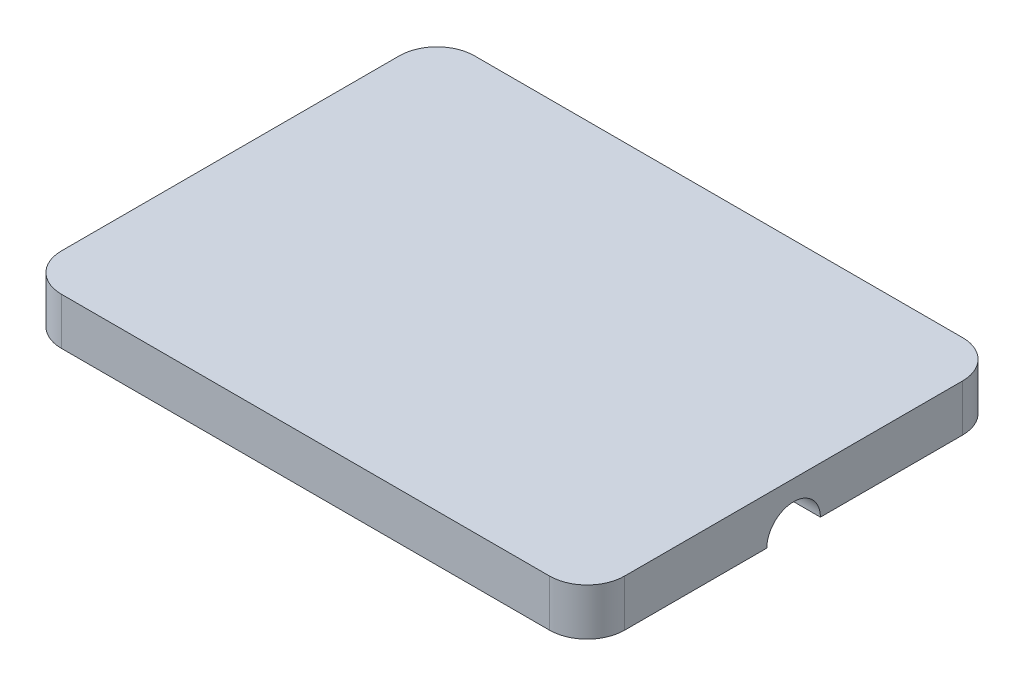
ISO-10303-21;
HEADER;
FILE_DESCRIPTION(('STEP AP214'),'2;1');
FILE_NAME('part.step','',(''),(''),'','','');
FILE_SCHEMA(('AUTOMOTIVE_DESIGN { 1 0 10303 214 1 1 1 1 }'));
ENDSEC;
DATA;
#1=APPLICATION_CONTEXT('core data for automotive mechanical design processes');
#2=APPLICATION_PROTOCOL_DEFINITION('international standard','automotive_design',2000,#1);
#3=PRODUCT_CONTEXT('',#1,'mechanical');
#4=PRODUCT('Part','Part','',(#3));
#5=PRODUCT_RELATED_PRODUCT_CATEGORY('part','',(#4));
#6=PRODUCT_DEFINITION_FORMATION('','',#4);
#7=PRODUCT_DEFINITION_CONTEXT('part definition',#1,'design');
#8=PRODUCT_DEFINITION('design','',#6,#7);
#9=PRODUCT_DEFINITION_SHAPE('','',#8);
#10=(LENGTH_UNIT() NAMED_UNIT(*) SI_UNIT(.MILLI.,.METRE.));
#11=(NAMED_UNIT(*) PLANE_ANGLE_UNIT() SI_UNIT($,.RADIAN.));
#12=(NAMED_UNIT(*) SI_UNIT($,.STERADIAN.) SOLID_ANGLE_UNIT());
#13=UNCERTAINTY_MEASURE_WITH_UNIT(LENGTH_MEASURE(1.E-05),#10,'distance_accuracy_value','');
#14=(GEOMETRIC_REPRESENTATION_CONTEXT(3) GLOBAL_UNCERTAINTY_ASSIGNED_CONTEXT((#13)) GLOBAL_UNIT_ASSIGNED_CONTEXT((#10,
#11,#12)) REPRESENTATION_CONTEXT('',''));
#15=CARTESIAN_POINT('',(0.,0.,0.));
#16=DIRECTION('',(0.,0.,1.));
#17=DIRECTION('',(1.,0.,0.));
#18=AXIS2_PLACEMENT_3D('',#15,#16,#17);
#19=CARTESIAN_POINT('',(20.,0.,-90.));
#20=DIRECTION('',(0.,1.,0.));
#21=DIRECTION('',(0.,0.,1.));
#22=AXIS2_PLACEMENT_3D('',#19,#20,#21);
#23=PLANE('',#22);
#24=DIRECTION('',(-1.,0.,0.));
#25=VECTOR('',#24,1.);
#26=CARTESIAN_POINT('',(300.,0.,-14.285));
#27=LINE('',#26,#25);
#28=CARTESIAN_POINT('',(0.,0.,-14.285));
#29=VERTEX_POINT('',#28);
#30=CARTESIAN_POINT('',(300.,0.,-14.285));
#31=VERTEX_POINT('',#30);
#32=EDGE_CURVE('E11',#29,#31,#27,.F.);
#33=ORIENTED_EDGE('',*,*,#32,.F.);
#34=DIRECTION('',(0.,0.,1.));
#35=VECTOR('',#34,1.);
#36=CARTESIAN_POINT('',(0.,0.,0.));
#37=LINE('',#36,#35);
#38=CARTESIAN_POINT('',(0.,0.,-89.9999999999999));
#39=VERTEX_POINT('',#38);
#40=EDGE_CURVE('E180',#39,#29,#37,.T.);
#41=ORIENTED_EDGE('',*,*,#40,.F.);
#42=CARTESIAN_POINT('',(20.,0.,-90.));
#43=DIRECTION('',(0.,1.,0.));
#44=DIRECTION('',(0.,0.,1.));
#45=AXIS2_PLACEMENT_3D('',#42,#43,#44);
#46=CIRCLE('',#45,20.);
#47=CARTESIAN_POINT('',(20.0000000000001,0.,-110.));
#48=VERTEX_POINT('',#47);
#49=EDGE_CURVE('E99',#48,#39,#46,.T.);
#50=ORIENTED_EDGE('',*,*,#49,.F.);
#51=DIRECTION('',(-1.,0.,0.));
#52=VECTOR('',#51,1.);
#53=CARTESIAN_POINT('',(20.0000000000001,0.,-110.));
#54=LINE('',#53,#52);
#55=CARTESIAN_POINT('',(280.,0.,-110.));
#56=VERTEX_POINT('',#55);
#57=EDGE_CURVE('E174',#56,#48,#54,.T.);
#58=ORIENTED_EDGE('',*,*,#57,.F.);
#59=CARTESIAN_POINT('',(280.,0.,-90.));
#60=DIRECTION('',(0.,1.,0.));
#61=DIRECTION('',(0.,0.,-1.));
#62=AXIS2_PLACEMENT_3D('',#59,#60,#61);
#63=CIRCLE('',#62,20.);
#64=CARTESIAN_POINT('',(300.,0.,-89.9999999999999));
#65=VERTEX_POINT('',#64);
#66=EDGE_CURVE('E140',#65,#56,#63,.T.);
#67=ORIENTED_EDGE('',*,*,#66,.F.);
#68=DIRECTION('',(0.,0.,-1.));
#69=VECTOR('',#68,1.);
#70=CARTESIAN_POINT('',(300.,0.,-89.9999999999999));
#71=LINE('',#70,#69);
#72=EDGE_CURVE('E167',#31,#65,#71,.T.);
#73=ORIENTED_EDGE('',*,*,#72,.F.);
#74=EDGE_LOOP('',(#33,#41,#50,#58,#67,#73));
#75=FACE_BOUND('',#74,.T.);
#76=ADVANCED_FACE('F40',(#75),#23,.F.);
#77=DIRECTION('',(-1.,0.,0.));
#78=VECTOR('',#77,1.);
#79=CARTESIAN_POINT('',(300.,0.,14.285));
#80=LINE('',#79,#78);
#81=CARTESIAN_POINT('',(300.,0.,14.285));
#82=VERTEX_POINT('',#81);
#83=CARTESIAN_POINT('',(0.,0.,14.285));
#84=VERTEX_POINT('',#83);
#85=EDGE_CURVE('E49',#82,#84,#80,.T.);
#86=ORIENTED_EDGE('',*,*,#85,.F.);
#87=CARTESIAN_POINT('',(300.,0.,89.9999999999999));
#88=VERTEX_POINT('',#87);
#89=EDGE_CURVE('E168',#88,#82,#71,.T.);
#90=ORIENTED_EDGE('',*,*,#89,.F.);
#91=CARTESIAN_POINT('',(280.,0.,90.));
#92=DIRECTION('',(0.,1.,0.));
#93=DIRECTION('',(0.,0.,1.));
#94=AXIS2_PLACEMENT_3D('',#91,#92,#93);
#95=CIRCLE('',#94,20.);
#96=CARTESIAN_POINT('',(280.,0.,110.));
#97=VERTEX_POINT('',#96);
#98=EDGE_CURVE('E163',#97,#88,#95,.T.);
#99=ORIENTED_EDGE('',*,*,#98,.F.);
#100=DIRECTION('',(1.,0.,0.));
#101=VECTOR('',#100,1.);
#102=CARTESIAN_POINT('',(280.,0.,110.));
#103=LINE('',#102,#101);
#104=CARTESIAN_POINT('',(20.0000000000001,0.,110.));
#105=VERTEX_POINT('',#104);
#106=EDGE_CURVE('E160',#105,#97,#103,.T.);
#107=ORIENTED_EDGE('',*,*,#106,.F.);
#108=CARTESIAN_POINT('',(20.,0.,90.));
#109=DIRECTION('',(0.,1.,0.));
#110=DIRECTION('',(0.,0.,-1.));
#111=AXIS2_PLACEMENT_3D('',#108,#109,#110);
#112=CIRCLE('',#111,20.);
#113=CARTESIAN_POINT('',(0.,0.,89.9999999999999));
#114=VERTEX_POINT('',#113);
#115=EDGE_CURVE('E157',#114,#105,#112,.T.);
#116=ORIENTED_EDGE('',*,*,#115,.F.);
#117=EDGE_CURVE('E179',#84,#114,#37,.T.);
#118=ORIENTED_EDGE('',*,*,#117,.F.);
#119=EDGE_LOOP('',(#86,#90,#99,#107,#116,#118));
#120=FACE_BOUND('',#119,.T.);
#121=ADVANCED_FACE('F219',(#120),#23,.F.);
#122=CARTESIAN_POINT('',(20.,25.,90.));
#123=DIRECTION('',(0.,-1.,0.));
#124=DIRECTION('',(0.,0.,-1.));
#125=AXIS2_PLACEMENT_3D('',#122,#123,#124);
#126=CYLINDRICAL_SURFACE('',#125,20.);
#127=ORIENTED_EDGE('',*,*,#115,.T.);
#128=DIRECTION('',(0.,-1.,0.));
#129=VECTOR('',#128,1.);
#130=CARTESIAN_POINT('',(20.0000000000001,25.,110.));
#131=LINE('',#130,#129);
#132=CARTESIAN_POINT('',(20.0000000000001,25.,110.));
#133=VERTEX_POINT('',#132);
#134=EDGE_CURVE('E198',#133,#105,#131,.T.);
#135=ORIENTED_EDGE('',*,*,#134,.F.);
#136=CARTESIAN_POINT('',(20.,25.,90.));
#137=DIRECTION('',(0.,1.,0.));
#138=DIRECTION('',(0.,0.,-1.));
#139=AXIS2_PLACEMENT_3D('',#136,#137,#138);
#140=CIRCLE('',#139,20.);
#141=CARTESIAN_POINT('',(0.,25.,89.9999999999999));
#142=VERTEX_POINT('',#141);
#143=EDGE_CURVE('E107',#142,#133,#140,.T.);
#144=ORIENTED_EDGE('',*,*,#143,.F.);
#145=DIRECTION('',(0.,-1.,0.));
#146=VECTOR('',#145,1.);
#147=CARTESIAN_POINT('',(0.,25.,89.9999999999999));
#148=LINE('',#147,#146);
#149=EDGE_CURVE('E202',#142,#114,#148,.T.);
#150=ORIENTED_EDGE('',*,*,#149,.T.);
#151=EDGE_LOOP('',(#127,#135,#144,#150));
#152=FACE_BOUND('',#151,.T.);
#153=ADVANCED_FACE('F42',(#152),#126,.T.);
#154=CARTESIAN_POINT('',(280.,25.,110.));
#155=DIRECTION('',(0.,0.,-1.));
#156=DIRECTION('',(-1.,0.,0.));
#157=AXIS2_PLACEMENT_3D('',#154,#155,#156);
#158=PLANE('',#157);
#159=ORIENTED_EDGE('',*,*,#106,.T.);
#160=DIRECTION('',(0.,-1.,0.));
#161=VECTOR('',#160,1.);
#162=CARTESIAN_POINT('',(280.,25.,110.));
#163=LINE('',#162,#161);
#164=CARTESIAN_POINT('',(280.,25.,110.));
#165=VERTEX_POINT('',#164);
#166=EDGE_CURVE('E194',#165,#97,#163,.T.);
#167=ORIENTED_EDGE('',*,*,#166,.F.);
#168=DIRECTION('',(1.,0.,0.));
#169=VECTOR('',#168,1.);
#170=CARTESIAN_POINT('',(280.,25.,110.));
#171=LINE('',#170,#169);
#172=EDGE_CURVE('E230',#133,#165,#171,.T.);
#173=ORIENTED_EDGE('',*,*,#172,.F.);
#174=ORIENTED_EDGE('',*,*,#134,.T.);
#175=EDGE_LOOP('',(#159,#167,#173,#174));
#176=FACE_BOUND('',#175,.T.);
#177=ADVANCED_FACE('F249',(#176),#158,.F.);
#178=CARTESIAN_POINT('',(280.,25.,90.));
#179=DIRECTION('',(0.,-1.,0.));
#180=DIRECTION('',(0.,0.,-1.));
#181=AXIS2_PLACEMENT_3D('',#178,#179,#180);
#182=CYLINDRICAL_SURFACE('',#181,20.);
#183=ORIENTED_EDGE('',*,*,#98,.T.);
#184=DIRECTION('',(0.,-1.,0.));
#185=VECTOR('',#184,1.);
#186=CARTESIAN_POINT('',(300.,25.,89.9999999999999));
#187=LINE('',#186,#185);
#188=CARTESIAN_POINT('',(300.,25.,89.9999999999999));
#189=VERTEX_POINT('',#188);
#190=EDGE_CURVE('E190',#189,#88,#187,.T.);
#191=ORIENTED_EDGE('',*,*,#190,.F.);
#192=CARTESIAN_POINT('',(280.,25.,90.));
#193=DIRECTION('',(0.,1.,0.));
#194=DIRECTION('',(0.,0.,1.));
#195=AXIS2_PLACEMENT_3D('',#192,#193,#194);
#196=CIRCLE('',#195,20.);
#197=EDGE_CURVE('E233',#165,#189,#196,.T.);
#198=ORIENTED_EDGE('',*,*,#197,.F.);
#199=ORIENTED_EDGE('',*,*,#166,.T.);
#200=EDGE_LOOP('',(#183,#191,#198,#199));
#201=FACE_BOUND('',#200,.T.);
#202=ADVANCED_FACE('F241',(#201),#182,.T.);
#203=CARTESIAN_POINT('',(300.,25.,-89.9999999999999));
#204=DIRECTION('',(-1.,0.,0.));
#205=DIRECTION('',(0.,0.,1.));
#206=AXIS2_PLACEMENT_3D('',#203,#204,#205);
#207=PLANE('',#206);
#208=CARTESIAN_POINT('',(300.,0.,0.));
#209=DIRECTION('',(1.,0.,0.));
#210=DIRECTION('',(0.,0.,-1.));
#211=AXIS2_PLACEMENT_3D('',#208,#209,#210);
#212=CIRCLE('',#211,14.285);
#213=EDGE_CURVE('E55',#31,#82,#212,.T.);
#214=ORIENTED_EDGE('',*,*,#213,.F.);
#215=ORIENTED_EDGE('',*,*,#72,.T.);
#216=DIRECTION('',(0.,-1.,0.));
#217=VECTOR('',#216,1.);
#218=CARTESIAN_POINT('',(300.,25.,-89.9999999999999));
#219=LINE('',#218,#217);
#220=CARTESIAN_POINT('',(300.,25.,-89.9999999999999));
#221=VERTEX_POINT('',#220);
#222=EDGE_CURVE('E144',#221,#65,#219,.T.);
#223=ORIENTED_EDGE('',*,*,#222,.F.);
#224=DIRECTION('',(0.,0.,-1.));
#225=VECTOR('',#224,1.);
#226=CARTESIAN_POINT('',(300.,25.,0.));
#227=LINE('',#226,#225);
#228=EDGE_CURVE('E130',#189,#221,#227,.T.);
#229=ORIENTED_EDGE('',*,*,#228,.F.);
#230=ORIENTED_EDGE('',*,*,#190,.T.);
#231=ORIENTED_EDGE('',*,*,#89,.T.);
#232=EDGE_LOOP('',(#214,#215,#223,#229,#230,#231));
#233=FACE_BOUND('',#232,.T.);
#234=ADVANCED_FACE('F244',(#233),#207,.F.);
#235=CARTESIAN_POINT('',(280.,25.,-90.));
#236=DIRECTION('',(0.,-1.,0.));
#237=DIRECTION('',(0.,0.,-1.));
#238=AXIS2_PLACEMENT_3D('',#235,#236,#237);
#239=CYLINDRICAL_SURFACE('',#238,20.);
#240=ORIENTED_EDGE('',*,*,#66,.T.);
#241=DIRECTION('',(0.,-1.,0.));
#242=VECTOR('',#241,1.);
#243=CARTESIAN_POINT('',(280.,25.,-110.));
#244=LINE('',#243,#242);
#245=CARTESIAN_POINT('',(280.,25.,-110.));
#246=VERTEX_POINT('',#245);
#247=EDGE_CURVE('E137',#246,#56,#244,.T.);
#248=ORIENTED_EDGE('',*,*,#247,.F.);
#249=CARTESIAN_POINT('',(280.,25.,-90.));
#250=DIRECTION('',(0.,1.,0.));
#251=DIRECTION('',(0.,0.,-1.));
#252=AXIS2_PLACEMENT_3D('',#249,#250,#251);
#253=CIRCLE('',#252,20.);
#254=EDGE_CURVE('E123',#221,#246,#253,.T.);
#255=ORIENTED_EDGE('',*,*,#254,.F.);
#256=ORIENTED_EDGE('',*,*,#222,.T.);
#257=EDGE_LOOP('',(#240,#248,#255,#256));
#258=FACE_BOUND('',#257,.T.);
#259=ADVANCED_FACE('F138',(#258),#239,.T.);
#260=CARTESIAN_POINT('',(20.0000000000001,25.,-110.));
#261=DIRECTION('',(0.,0.,1.));
#262=DIRECTION('',(1.,0.,0.));
#263=AXIS2_PLACEMENT_3D('',#260,#261,#262);
#264=PLANE('',#263);
#265=ORIENTED_EDGE('',*,*,#57,.T.);
#266=DIRECTION('',(0.,-1.,0.));
#267=VECTOR('',#266,1.);
#268=CARTESIAN_POINT('',(20.0000000000001,25.,-110.));
#269=LINE('',#268,#267);
#270=CARTESIAN_POINT('',(20.0000000000001,25.,-110.));
#271=VERTEX_POINT('',#270);
#272=EDGE_CURVE('E145',#271,#48,#269,.T.);
#273=ORIENTED_EDGE('',*,*,#272,.F.);
#274=DIRECTION('',(-1.,0.,0.));
#275=VECTOR('',#274,1.);
#276=CARTESIAN_POINT('',(20.0000000000001,25.,-110.));
#277=LINE('',#276,#275);
#278=EDGE_CURVE('E127',#246,#271,#277,.T.);
#279=ORIENTED_EDGE('',*,*,#278,.F.);
#280=ORIENTED_EDGE('',*,*,#247,.T.);
#281=EDGE_LOOP('',(#265,#273,#279,#280));
#282=FACE_BOUND('',#281,.T.);
#283=ADVANCED_FACE('F147',(#282),#264,.F.);
#284=CARTESIAN_POINT('',(20.,25.,-90.));
#285=DIRECTION('',(0.,-1.,0.));
#286=DIRECTION('',(0.,0.,-1.));
#287=AXIS2_PLACEMENT_3D('',#284,#285,#286);
#288=CYLINDRICAL_SURFACE('',#287,20.);
#289=ORIENTED_EDGE('',*,*,#49,.T.);
#290=DIRECTION('',(0.,-1.,0.));
#291=VECTOR('',#290,1.);
#292=CARTESIAN_POINT('',(0.,25.,-89.9999999999999));
#293=LINE('',#292,#291);
#294=CARTESIAN_POINT('',(0.,25.,-89.9999999999999));
#295=VERTEX_POINT('',#294);
#296=EDGE_CURVE('E153',#295,#39,#293,.T.);
#297=ORIENTED_EDGE('',*,*,#296,.F.);
#298=CARTESIAN_POINT('',(20.,25.,-90.));
#299=DIRECTION('',(0.,1.,0.));
#300=DIRECTION('',(0.,0.,1.));
#301=AXIS2_PLACEMENT_3D('',#298,#299,#300);
#302=CIRCLE('',#301,20.);
#303=EDGE_CURVE('E150',#271,#295,#302,.T.);
#304=ORIENTED_EDGE('',*,*,#303,.F.);
#305=ORIENTED_EDGE('',*,*,#272,.T.);
#306=EDGE_LOOP('',(#289,#297,#304,#305));
#307=FACE_BOUND('',#306,.T.);
#308=ADVANCED_FACE('F247',(#307),#288,.T.);
#309=CARTESIAN_POINT('',(0.,25.,0.));
#310=DIRECTION('',(1.,0.,0.));
#311=DIRECTION('',(0.,0.,-1.));
#312=AXIS2_PLACEMENT_3D('',#309,#310,#311);
#313=PLANE('',#312);
#314=CARTESIAN_POINT('',(0.,0.,0.));
#315=DIRECTION('',(1.,0.,0.));
#316=DIRECTION('',(0.,0.,-1.));
#317=AXIS2_PLACEMENT_3D('',#314,#315,#316);
#318=CIRCLE('',#317,14.285);
#319=EDGE_CURVE('E210',#29,#84,#318,.T.);
#320=ORIENTED_EDGE('',*,*,#319,.T.);
#321=ORIENTED_EDGE('',*,*,#117,.T.);
#322=ORIENTED_EDGE('',*,*,#149,.F.);
#323=DIRECTION('',(0.,0.,1.));
#324=VECTOR('',#323,1.);
#325=CARTESIAN_POINT('',(0.,25.,89.9999999999999));
#326=LINE('',#325,#324);
#327=EDGE_CURVE('E64',#295,#142,#326,.T.);
#328=ORIENTED_EDGE('',*,*,#327,.F.);
#329=ORIENTED_EDGE('',*,*,#296,.T.);
#330=ORIENTED_EDGE('',*,*,#40,.T.);
#331=EDGE_LOOP('',(#320,#321,#322,#328,#329,#330));
#332=FACE_BOUND('',#331,.T.);
#333=ADVANCED_FACE('F214',(#332),#313,.F.);
#334=CARTESIAN_POINT('',(20.,25.,-90.));
#335=DIRECTION('',(0.,1.,0.));
#336=DIRECTION('',(0.,0.,1.));
#337=AXIS2_PLACEMENT_3D('',#334,#335,#336);
#338=PLANE('',#337);
#339=ORIENTED_EDGE('',*,*,#327,.T.);
#340=ORIENTED_EDGE('',*,*,#143,.T.);
#341=ORIENTED_EDGE('',*,*,#172,.T.);
#342=ORIENTED_EDGE('',*,*,#197,.T.);
#343=ORIENTED_EDGE('',*,*,#228,.T.);
#344=ORIENTED_EDGE('',*,*,#254,.T.);
#345=ORIENTED_EDGE('',*,*,#278,.T.);
#346=ORIENTED_EDGE('',*,*,#303,.T.);
#347=EDGE_LOOP('',(#339,#340,#341,#342,#343,#344,#345,#346));
#348=FACE_BOUND('',#347,.T.);
#349=ADVANCED_FACE('F125',(#348),#338,.T.);
#350=CARTESIAN_POINT('',(300.,0.,0.));
#351=DIRECTION('',(-1.,0.,0.));
#352=DIRECTION('',(0.,0.,1.));
#353=AXIS2_PLACEMENT_3D('',#350,#351,#352);
#354=CYLINDRICAL_SURFACE('',#353,14.285);
#355=ORIENTED_EDGE('',*,*,#32,.T.);
#356=ORIENTED_EDGE('',*,*,#213,.T.);
#357=ORIENTED_EDGE('',*,*,#85,.T.);
#358=ORIENTED_EDGE('',*,*,#319,.F.);
#359=EDGE_LOOP('',(#355,#356,#357,#358));
#360=FACE_BOUND('',#359,.T.);
#361=ADVANCED_FACE('F208',(#360),#354,.F.);
#362=CLOSED_SHELL('',(#76,#121,#153,#177,#202,#234,#259,#283,#308,#333,#349,#361));
#363=MANIFOLD_SOLID_BREP('B2',#362);
#364=ADVANCED_BREP_SHAPE_REPRESENTATION('',(#18,#363),#14);
#365=SHAPE_DEFINITION_REPRESENTATION(#9,#364);
ENDSEC;
END-ISO-10303-21;
